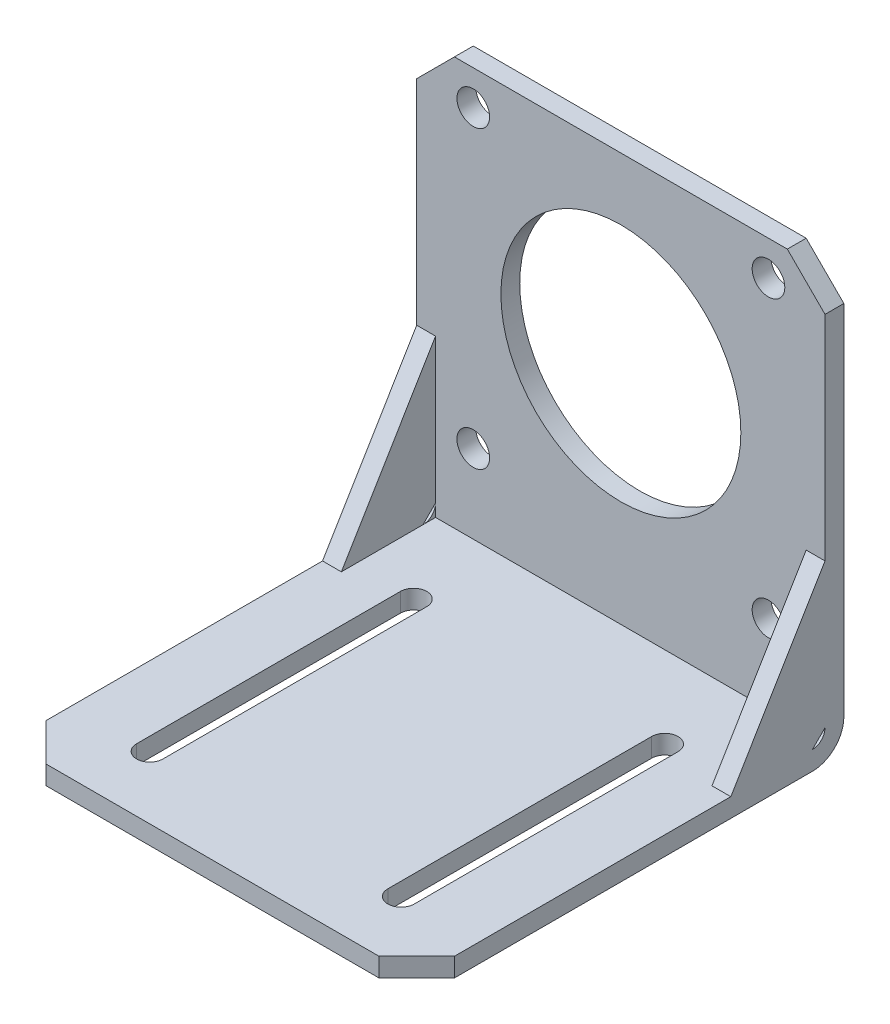
ISO-10303-21;
HEADER;
FILE_DESCRIPTION(('STEP AP214'),'2;1');
FILE_NAME('part.step','',(''),(''),'','','');
FILE_SCHEMA(('AUTOMOTIVE_DESIGN { 1 0 10303 214 1 1 1 1 }'));
ENDSEC;
DATA;
#1=APPLICATION_CONTEXT('core data for automotive mechanical design processes');
#2=APPLICATION_PROTOCOL_DEFINITION('international standard','automotive_design',2000,#1);
#3=PRODUCT_CONTEXT('',#1,'mechanical');
#4=PRODUCT('Part','Part','',(#3));
#5=PRODUCT_RELATED_PRODUCT_CATEGORY('part','',(#4));
#6=PRODUCT_DEFINITION_FORMATION('','',#4);
#7=PRODUCT_DEFINITION_CONTEXT('part definition',#1,'design');
#8=PRODUCT_DEFINITION('design','',#6,#7);
#9=PRODUCT_DEFINITION_SHAPE('','',#8);
#10=(LENGTH_UNIT() NAMED_UNIT(*) SI_UNIT(.MILLI.,.METRE.));
#11=(NAMED_UNIT(*) PLANE_ANGLE_UNIT() SI_UNIT($,.RADIAN.));
#12=(NAMED_UNIT(*) SI_UNIT($,.STERADIAN.) SOLID_ANGLE_UNIT());
#13=UNCERTAINTY_MEASURE_WITH_UNIT(LENGTH_MEASURE(1.E-05),#10,'distance_accuracy_value','');
#14=(GEOMETRIC_REPRESENTATION_CONTEXT(3) GLOBAL_UNCERTAINTY_ASSIGNED_CONTEXT((#13)) GLOBAL_UNIT_ASSIGNED_CONTEXT((#10,
#11,#12)) REPRESENTATION_CONTEXT('',''));
#15=CARTESIAN_POINT('',(0.,0.,0.));
#16=DIRECTION('',(0.,0.,1.));
#17=DIRECTION('',(1.,0.,0.));
#18=AXIS2_PLACEMENT_3D('',#15,#16,#17);
#19=CARTESIAN_POINT('',(0.,0.,0.));
#20=DIRECTION('',(0.,0.,1.));
#21=DIRECTION('',(1.,0.,0.));
#22=AXIS2_PLACEMENT_3D('',#19,#20,#21);
#23=PLANE('',#22);
#24=CARTESIAN_POINT('',(-23.5,12.5,0.));
#25=DIRECTION('',(0.,0.,1.));
#26=DIRECTION('',(1.,0.,0.));
#27=AXIS2_PLACEMENT_3D('',#24,#25,#26);
#28=CIRCLE('',#27,2.6);
#29=CARTESIAN_POINT('',(-20.9,12.5,0.));
#30=VERTEX_POINT('',#29);
#31=EDGE_CURVE('E468',#30,#30,#28,.T.);
#32=ORIENTED_EDGE('',*,*,#31,.T.);
#33=EDGE_LOOP('',(#32));
#34=FACE_BOUND('',#33,.T.);
#35=CARTESIAN_POINT('',(23.5,59.5,0.));
#36=DIRECTION('',(0.,0.,1.));
#37=DIRECTION('',(1.,0.,0.));
#38=AXIS2_PLACEMENT_3D('',#35,#36,#37);
#39=CIRCLE('',#38,2.6);
#40=CARTESIAN_POINT('',(26.1,59.5,0.));
#41=VERTEX_POINT('',#40);
#42=EDGE_CURVE('E456',#41,#41,#39,.T.);
#43=ORIENTED_EDGE('',*,*,#42,.T.);
#44=EDGE_LOOP('',(#43));
#45=FACE_BOUND('',#44,.T.);
#46=CARTESIAN_POINT('',(0.,36.,0.));
#47=DIRECTION('',(0.,0.,1.));
#48=DIRECTION('',(1.,0.,0.));
#49=AXIS2_PLACEMENT_3D('',#46,#47,#48);
#50=CIRCLE('',#49,19.1);
#51=CARTESIAN_POINT('',(19.1,36.,0.));
#52=VERTEX_POINT('',#51);
#53=EDGE_CURVE('E444',#52,#52,#50,.T.);
#54=ORIENTED_EDGE('',*,*,#53,.T.);
#55=EDGE_LOOP('',(#54));
#56=FACE_BOUND('',#55,.T.);
#57=CARTESIAN_POINT('',(-23.5,59.5,0.));
#58=DIRECTION('',(0.,0.,1.));
#59=DIRECTION('',(1.,0.,0.));
#60=AXIS2_PLACEMENT_3D('',#57,#58,#59);
#61=CIRCLE('',#60,2.6);
#62=CARTESIAN_POINT('',(-20.9,59.5,0.));
#63=VERTEX_POINT('',#62);
#64=EDGE_CURVE('E450',#63,#63,#61,.T.);
#65=ORIENTED_EDGE('',*,*,#64,.T.);
#66=EDGE_LOOP('',(#65));
#67=FACE_BOUND('',#66,.T.);
#68=CARTESIAN_POINT('',(23.5,12.5,0.));
#69=DIRECTION('',(0.,0.,1.));
#70=DIRECTION('',(1.,0.,0.));
#71=AXIS2_PLACEMENT_3D('',#68,#69,#70);
#72=CIRCLE('',#71,2.6);
#73=CARTESIAN_POINT('',(26.1,12.5,0.));
#74=VERTEX_POINT('',#73);
#75=EDGE_CURVE('E462',#74,#74,#72,.T.);
#76=ORIENTED_EDGE('',*,*,#75,.T.);
#77=EDGE_LOOP('',(#76));
#78=FACE_BOUND('',#77,.T.);
#79=DIRECTION('',(-1.,0.,0.));
#80=VECTOR('',#79,1.);
#81=CARTESIAN_POINT('',(32.5,1.99999999999998,0.));
#82=LINE('',#81,#80);
#83=CARTESIAN_POINT('',(32.5,1.99999999999998,0.));
#84=VERTEX_POINT('',#83);
#85=CARTESIAN_POINT('',(-32.5,1.99999999999998,0.));
#86=VERTEX_POINT('',#85);
#87=EDGE_CURVE('E246',#84,#86,#82,.T.);
#88=ORIENTED_EDGE('',*,*,#87,.T.);
#89=DIRECTION('',(0.,-1.,0.));
#90=VECTOR('',#89,1.);
#91=CARTESIAN_POINT('',(-32.5,59.,0.));
#92=LINE('',#91,#90);
#93=CARTESIAN_POINT('',(-32.5,59.,0.));
#94=VERTEX_POINT('',#93);
#95=EDGE_CURVE('E418',#94,#86,#92,.T.);
#96=ORIENTED_EDGE('',*,*,#95,.F.);
#97=DIRECTION('',(-0.707106781186548,-0.707106781186547,0.));
#98=VECTOR('',#97,1.);
#99=CARTESIAN_POINT('',(-32.5,59.,0.));
#100=LINE('',#99,#98);
#101=CARTESIAN_POINT('',(-26.5,65.,0.));
#102=VERTEX_POINT('',#101);
#103=EDGE_CURVE('E415',#102,#94,#100,.T.);
#104=ORIENTED_EDGE('',*,*,#103,.F.);
#105=DIRECTION('',(-1.,0.,0.));
#106=VECTOR('',#105,1.);
#107=CARTESIAN_POINT('',(-26.5,65.,0.));
#108=LINE('',#107,#106);
#109=CARTESIAN_POINT('',(26.5,65.,0.));
#110=VERTEX_POINT('',#109);
#111=EDGE_CURVE('E413',#110,#102,#108,.T.);
#112=ORIENTED_EDGE('',*,*,#111,.F.);
#113=DIRECTION('',(-0.707106781186547,0.707106781186548,0.));
#114=VECTOR('',#113,1.);
#115=CARTESIAN_POINT('',(32.5,59.,0.));
#116=LINE('',#115,#114);
#117=CARTESIAN_POINT('',(32.5,59.,0.));
#118=VERTEX_POINT('',#117);
#119=EDGE_CURVE('E423',#118,#110,#116,.T.);
#120=ORIENTED_EDGE('',*,*,#119,.F.);
#121=DIRECTION('',(0.,1.,0.));
#122=VECTOR('',#121,1.);
#123=CARTESIAN_POINT('',(32.5,0.,0.));
#124=LINE('',#123,#122);
#125=EDGE_CURVE('E421',#84,#118,#124,.T.);
#126=ORIENTED_EDGE('',*,*,#125,.F.);
#127=EDGE_LOOP('',(#88,#96,#104,#112,#120,#126));
#128=FACE_BOUND('',#127,.T.);
#129=ADVANCED_FACE('F32',(#34,#45,#56,#67,#78,#128),#23,.F.);
#130=CARTESIAN_POINT('',(32.5,-3.00000000000002,0.));
#131=DIRECTION('',(0.,-1.,0.));
#132=DIRECTION('',(0.,0.,-1.));
#133=AXIS2_PLACEMENT_3D('',#130,#131,#132);
#134=PLANE('',#133);
#135=CARTESIAN_POINT('',(20.,-2.99999999999998,58.));
#136=DIRECTION('',(0.,1.,0.));
#137=DIRECTION('',(0.,0.,1.));
#138=AXIS2_PLACEMENT_3D('',#135,#136,#137);
#139=CIRCLE('',#138,2.1);
#140=CARTESIAN_POINT('',(17.9,-2.99999999999998,58.));
#141=VERTEX_POINT('',#140);
#142=CARTESIAN_POINT('',(22.1,-2.99999999999998,58.));
#143=VERTEX_POINT('',#142);
#144=EDGE_CURVE('E283',#141,#143,#139,.T.);
#145=ORIENTED_EDGE('',*,*,#144,.T.);
#146=DIRECTION('',(0.,0.,-1.));
#147=VECTOR('',#146,1.);
#148=CARTESIAN_POINT('',(22.1,-2.99999999999998,58.));
#149=LINE('',#148,#147);
#150=CARTESIAN_POINT('',(22.1,-3.00000000000002,16.));
#151=VERTEX_POINT('',#150);
#152=EDGE_CURVE('E286',#143,#151,#149,.T.);
#153=ORIENTED_EDGE('',*,*,#152,.T.);
#154=CARTESIAN_POINT('',(20.,-3.,16.));
#155=DIRECTION('',(0.,1.,0.));
#156=DIRECTION('',(0.,0.,1.));
#157=AXIS2_PLACEMENT_3D('',#154,#155,#156);
#158=CIRCLE('',#157,2.1);
#159=CARTESIAN_POINT('',(17.9,-3.,16.));
#160=VERTEX_POINT('',#159);
#161=EDGE_CURVE('E290',#151,#160,#158,.T.);
#162=ORIENTED_EDGE('',*,*,#161,.T.);
#163=DIRECTION('',(0.,0.,1.));
#164=VECTOR('',#163,1.);
#165=CARTESIAN_POINT('',(17.9,-2.99999999999998,58.));
#166=LINE('',#165,#164);
#167=EDGE_CURVE('E293',#160,#141,#166,.T.);
#168=ORIENTED_EDGE('',*,*,#167,.T.);
#169=EDGE_LOOP('',(#145,#153,#162,#168));
#170=FACE_BOUND('',#169,.T.);
#171=CARTESIAN_POINT('',(-20.,-2.99999999999998,58.));
#172=DIRECTION('',(0.,1.,0.));
#173=DIRECTION('',(0.,0.,1.));
#174=AXIS2_PLACEMENT_3D('',#171,#172,#173);
#175=CIRCLE('',#174,2.1);
#176=CARTESIAN_POINT('',(-22.1,-2.99999999999998,58.));
#177=VERTEX_POINT('',#176);
#178=CARTESIAN_POINT('',(-17.9,-2.99999999999998,58.));
#179=VERTEX_POINT('',#178);
#180=EDGE_CURVE('E251',#177,#179,#175,.T.);
#181=ORIENTED_EDGE('',*,*,#180,.T.);
#182=DIRECTION('',(0.,0.,-1.));
#183=VECTOR('',#182,1.);
#184=CARTESIAN_POINT('',(-17.9,-2.99999999999998,58.));
#185=LINE('',#184,#183);
#186=CARTESIAN_POINT('',(-17.9,-3.00000000000002,16.));
#187=VERTEX_POINT('',#186);
#188=EDGE_CURVE('E254',#179,#187,#185,.T.);
#189=ORIENTED_EDGE('',*,*,#188,.T.);
#190=CARTESIAN_POINT('',(-20.,-3.,16.));
#191=DIRECTION('',(0.,1.,0.));
#192=DIRECTION('',(0.,0.,1.));
#193=AXIS2_PLACEMENT_3D('',#190,#191,#192);
#194=CIRCLE('',#193,2.1);
#195=CARTESIAN_POINT('',(-22.1,-3.,16.));
#196=VERTEX_POINT('',#195);
#197=EDGE_CURVE('E258',#187,#196,#194,.T.);
#198=ORIENTED_EDGE('',*,*,#197,.T.);
#199=DIRECTION('',(0.,0.,1.));
#200=VECTOR('',#199,1.);
#201=CARTESIAN_POINT('',(-22.1,-2.99999999999998,58.));
#202=LINE('',#201,#200);
#203=EDGE_CURVE('E261',#196,#177,#202,.T.);
#204=ORIENTED_EDGE('',*,*,#203,.T.);
#205=EDGE_LOOP('',(#181,#189,#198,#204));
#206=FACE_BOUND('',#205,.T.);
#207=DIRECTION('',(0.,0.,1.));
#208=VECTOR('',#207,1.);
#209=CARTESIAN_POINT('',(-32.5,-3.00000000000002,0.));
#210=LINE('',#209,#208);
#211=CARTESIAN_POINT('',(-32.5,-3.00000000000002,5.));
#212=VERTEX_POINT('',#211);
#213=CARTESIAN_POINT('',(-32.5,-3.00000000000002,62.));
#214=VERTEX_POINT('',#213);
#215=EDGE_CURVE('E378',#212,#214,#210,.T.);
#216=ORIENTED_EDGE('',*,*,#215,.F.);
#217=DIRECTION('',(-1.,0.,0.));
#218=VECTOR('',#217,1.);
#219=CARTESIAN_POINT('',(32.5,-3.00000000000002,5.));
#220=LINE('',#219,#218);
#221=CARTESIAN_POINT('',(32.5,-3.00000000000002,5.));
#222=VERTEX_POINT('',#221);
#223=EDGE_CURVE('E244',#222,#212,#220,.T.);
#224=ORIENTED_EDGE('',*,*,#223,.F.);
#225=DIRECTION('',(0.,0.,1.));
#226=VECTOR('',#225,1.);
#227=CARTESIAN_POINT('',(32.5,-3.00000000000002,0.));
#228=LINE('',#227,#226);
#229=CARTESIAN_POINT('',(32.5,-2.99999999999998,62.));
#230=VERTEX_POINT('',#229);
#231=EDGE_CURVE('E373',#222,#230,#228,.T.);
#232=ORIENTED_EDGE('',*,*,#231,.T.);
#233=DIRECTION('',(-0.707106781186542,0.,0.707106781186553));
#234=VECTOR('',#233,1.);
#235=CARTESIAN_POINT('',(32.5,-2.99999999999998,62.));
#236=LINE('',#235,#234);
#237=CARTESIAN_POINT('',(26.5000000000001,-3.00000000000002,68.));
#238=VERTEX_POINT('',#237);
#239=EDGE_CURVE('E315',#230,#238,#236,.T.);
#240=ORIENTED_EDGE('',*,*,#239,.T.);
#241=DIRECTION('',(-1.,0.,0.));
#242=VECTOR('',#241,1.);
#243=CARTESIAN_POINT('',(32.5,-3.00000000000002,68.));
#244=LINE('',#243,#242);
#245=CARTESIAN_POINT('',(-26.4999999999999,-2.99999999999998,68.));
#246=VERTEX_POINT('',#245);
#247=EDGE_CURVE('E474',#238,#246,#244,.T.);
#248=ORIENTED_EDGE('',*,*,#247,.T.);
#249=DIRECTION('',(-0.707106781186553,0.,-0.707106781186542));
#250=VECTOR('',#249,1.);
#251=CARTESIAN_POINT('',(-32.5,-2.99999999999998,62.));
#252=LINE('',#251,#250);
#253=EDGE_CURVE('E325',#246,#214,#252,.T.);
#254=ORIENTED_EDGE('',*,*,#253,.T.);
#255=EDGE_LOOP('',(#216,#224,#232,#240,#248,#254));
#256=FACE_BOUND('',#255,.T.);
#257=ADVANCED_FACE('F511',(#170,#206,#256),#134,.T.);
#258=CARTESIAN_POINT('',(0.,0.,3.));
#259=DIRECTION('',(0.,0.,1.));
#260=DIRECTION('',(1.,0.,0.));
#261=AXIS2_PLACEMENT_3D('',#258,#259,#260);
#262=PLANE('',#261);
#263=DIRECTION('',(1.,0.,0.));
#264=VECTOR('',#263,1.);
#265=CARTESIAN_POINT('',(29.5,25.,3.));
#266=LINE('',#265,#264);
#267=CARTESIAN_POINT('',(29.5,25.,3.));
#268=VERTEX_POINT('',#267);
#269=CARTESIAN_POINT('',(32.5,25.,3.));
#270=VERTEX_POINT('',#269);
#271=EDGE_CURVE('E345',#268,#270,#266,.T.);
#272=ORIENTED_EDGE('',*,*,#271,.T.);
#273=DIRECTION('',(0.,1.,0.));
#274=VECTOR('',#273,1.);
#275=CARTESIAN_POINT('',(32.5,0.,3.));
#276=LINE('',#275,#274);
#277=CARTESIAN_POINT('',(32.5,59.,3.));
#278=VERTEX_POINT('',#277);
#279=EDGE_CURVE('E399',#270,#278,#276,.T.);
#280=ORIENTED_EDGE('',*,*,#279,.T.);
#281=DIRECTION('',(-0.707106781186547,0.707106781186548,0.));
#282=VECTOR('',#281,1.);
#283=CARTESIAN_POINT('',(32.5,59.,3.));
#284=LINE('',#283,#282);
#285=CARTESIAN_POINT('',(26.5,65.,3.));
#286=VERTEX_POINT('',#285);
#287=EDGE_CURVE('E401',#278,#286,#284,.T.);
#288=ORIENTED_EDGE('',*,*,#287,.T.);
#289=DIRECTION('',(-1.,0.,0.));
#290=VECTOR('',#289,1.);
#291=CARTESIAN_POINT('',(-26.5,65.,3.));
#292=LINE('',#291,#290);
#293=CARTESIAN_POINT('',(-26.5,65.,3.));
#294=VERTEX_POINT('',#293);
#295=EDGE_CURVE('E425',#286,#294,#292,.T.);
#296=ORIENTED_EDGE('',*,*,#295,.T.);
#297=DIRECTION('',(-0.707106781186548,-0.707106781186547,0.));
#298=VECTOR('',#297,1.);
#299=CARTESIAN_POINT('',(-32.5,59.,3.));
#300=LINE('',#299,#298);
#301=CARTESIAN_POINT('',(-32.5,59.,3.));
#302=VERTEX_POINT('',#301);
#303=EDGE_CURVE('E409',#294,#302,#300,.T.);
#304=ORIENTED_EDGE('',*,*,#303,.T.);
#305=DIRECTION('',(0.,-1.,0.));
#306=VECTOR('',#305,1.);
#307=CARTESIAN_POINT('',(-32.5,59.,3.));
#308=LINE('',#307,#306);
#309=CARTESIAN_POINT('',(-32.5,25.,3.));
#310=VERTEX_POINT('',#309);
#311=EDGE_CURVE('E397',#302,#310,#308,.T.);
#312=ORIENTED_EDGE('',*,*,#311,.T.);
#313=DIRECTION('',(-1.,0.,0.));
#314=VECTOR('',#313,1.);
#315=CARTESIAN_POINT('',(-29.5,25.,3.));
#316=LINE('',#315,#314);
#317=CARTESIAN_POINT('',(-29.5,25.,3.));
#318=VERTEX_POINT('',#317);
#319=EDGE_CURVE('E366',#318,#310,#316,.T.);
#320=ORIENTED_EDGE('',*,*,#319,.F.);
#321=DIRECTION('',(0.,-1.,0.));
#322=VECTOR('',#321,1.);
#323=CARTESIAN_POINT('',(-29.5,0.,3.));
#324=LINE('',#323,#322);
#325=CARTESIAN_POINT('',(-29.5,0.,3.));
#326=VERTEX_POINT('',#325);
#327=EDGE_CURVE('E353',#318,#326,#324,.T.);
#328=ORIENTED_EDGE('',*,*,#327,.T.);
#329=DIRECTION('',(1.,0.,0.));
#330=VECTOR('',#329,1.);
#331=CARTESIAN_POINT('',(-32.5,0.,3.));
#332=LINE('',#331,#330);
#333=CARTESIAN_POINT('',(29.5,0.,3.));
#334=VERTEX_POINT('',#333);
#335=EDGE_CURVE('E402',#326,#334,#332,.T.);
#336=ORIENTED_EDGE('',*,*,#335,.T.);
#337=DIRECTION('',(0.,1.,0.));
#338=VECTOR('',#337,1.);
#339=CARTESIAN_POINT('',(29.5,0.,3.));
#340=LINE('',#339,#338);
#341=EDGE_CURVE('E336',#334,#268,#340,.T.);
#342=ORIENTED_EDGE('',*,*,#341,.T.);
#343=EDGE_LOOP('',(#272,#280,#288,#296,#304,#312,#320,#328,#336,#342));
#344=FACE_BOUND('',#343,.T.);
#345=CARTESIAN_POINT('',(23.5,12.5,3.));
#346=DIRECTION('',(0.,0.,1.));
#347=DIRECTION('',(1.,0.,0.));
#348=AXIS2_PLACEMENT_3D('',#345,#346,#347);
#349=CIRCLE('',#348,2.6);
#350=CARTESIAN_POINT('',(26.1,12.5,3.));
#351=VERTEX_POINT('',#350);
#352=EDGE_CURVE('E459',#351,#351,#349,.T.);
#353=ORIENTED_EDGE('',*,*,#352,.F.);
#354=EDGE_LOOP('',(#353));
#355=FACE_BOUND('',#354,.T.);
#356=CARTESIAN_POINT('',(-23.5,59.5,3.));
#357=DIRECTION('',(0.,0.,1.));
#358=DIRECTION('',(1.,0.,0.));
#359=AXIS2_PLACEMENT_3D('',#356,#357,#358);
#360=CIRCLE('',#359,2.6);
#361=CARTESIAN_POINT('',(-20.9,59.5,3.));
#362=VERTEX_POINT('',#361);
#363=EDGE_CURVE('E447',#362,#362,#360,.T.);
#364=ORIENTED_EDGE('',*,*,#363,.F.);
#365=EDGE_LOOP('',(#364));
#366=FACE_BOUND('',#365,.T.);
#367=CARTESIAN_POINT('',(0.,36.,3.));
#368=DIRECTION('',(0.,0.,1.));
#369=DIRECTION('',(1.,0.,0.));
#370=AXIS2_PLACEMENT_3D('',#367,#368,#369);
#371=CIRCLE('',#370,19.1);
#372=CARTESIAN_POINT('',(19.1,36.,3.));
#373=VERTEX_POINT('',#372);
#374=EDGE_CURVE('E416',#373,#373,#371,.T.);
#375=ORIENTED_EDGE('',*,*,#374,.F.);
#376=EDGE_LOOP('',(#375));
#377=FACE_BOUND('',#376,.T.);
#378=CARTESIAN_POINT('',(23.5,59.5,3.));
#379=DIRECTION('',(0.,0.,1.));
#380=DIRECTION('',(1.,0.,0.));
#381=AXIS2_PLACEMENT_3D('',#378,#379,#380);
#382=CIRCLE('',#381,2.6);
#383=CARTESIAN_POINT('',(26.1,59.5,3.));
#384=VERTEX_POINT('',#383);
#385=EDGE_CURVE('E453',#384,#384,#382,.T.);
#386=ORIENTED_EDGE('',*,*,#385,.F.);
#387=EDGE_LOOP('',(#386));
#388=FACE_BOUND('',#387,.T.);
#389=CARTESIAN_POINT('',(-23.5,12.5,3.));
#390=DIRECTION('',(0.,0.,1.));
#391=DIRECTION('',(1.,0.,0.));
#392=AXIS2_PLACEMENT_3D('',#389,#390,#391);
#393=CIRCLE('',#392,2.6);
#394=CARTESIAN_POINT('',(-20.9,12.5,3.));
#395=VERTEX_POINT('',#394);
#396=EDGE_CURVE('E465',#395,#395,#393,.T.);
#397=ORIENTED_EDGE('',*,*,#396,.F.);
#398=EDGE_LOOP('',(#397));
#399=FACE_BOUND('',#398,.T.);
#400=ADVANCED_FACE('F500',(#344,#355,#366,#377,#388,#399),#262,.T.);
#401=CARTESIAN_POINT('',(-26.5,65.,3.));
#402=DIRECTION('',(0.,-1.,0.));
#403=DIRECTION('',(1.,0.,0.));
#404=AXIS2_PLACEMENT_3D('',#401,#402,#403);
#405=PLANE('',#404);
#406=ORIENTED_EDGE('',*,*,#111,.T.);
#407=DIRECTION('',(0.,0.,-1.));
#408=VECTOR('',#407,1.);
#409=CARTESIAN_POINT('',(-26.5,65.,3.));
#410=LINE('',#409,#408);
#411=EDGE_CURVE('E380',#294,#102,#410,.T.);
#412=ORIENTED_EDGE('',*,*,#411,.F.);
#413=ORIENTED_EDGE('',*,*,#295,.F.);
#414=DIRECTION('',(0.,0.,-1.));
#415=VECTOR('',#414,1.);
#416=CARTESIAN_POINT('',(26.5,65.,3.));
#417=LINE('',#416,#415);
#418=EDGE_CURVE('E412',#286,#110,#417,.T.);
#419=ORIENTED_EDGE('',*,*,#418,.T.);
#420=EDGE_LOOP('',(#406,#412,#413,#419));
#421=FACE_BOUND('',#420,.T.);
#422=ADVANCED_FACE('F34',(#421),#405,.F.);
#423=CARTESIAN_POINT('',(-32.5,59.,3.));
#424=DIRECTION('',(0.707106781186547,-0.707106781186548,0.));
#425=DIRECTION('',(0.707106781186548,0.707106781186547,0.));
#426=AXIS2_PLACEMENT_3D('',#423,#424,#425);
#427=PLANE('',#426);
#428=ORIENTED_EDGE('',*,*,#103,.T.);
#429=DIRECTION('',(0.,0.,-1.));
#430=VECTOR('',#429,1.);
#431=CARTESIAN_POINT('',(-32.5,59.,3.));
#432=LINE('',#431,#430);
#433=EDGE_CURVE('E385',#302,#94,#432,.T.);
#434=ORIENTED_EDGE('',*,*,#433,.F.);
#435=ORIENTED_EDGE('',*,*,#303,.F.);
#436=ORIENTED_EDGE('',*,*,#411,.T.);
#437=EDGE_LOOP('',(#428,#434,#435,#436));
#438=FACE_BOUND('',#437,.T.);
#439=ADVANCED_FACE('F552',(#438),#427,.F.);
#440=CARTESIAN_POINT('',(-32.5,59.,3.));
#441=DIRECTION('',(1.,0.,0.));
#442=DIRECTION('',(0.,0.,-1.));
#443=AXIS2_PLACEMENT_3D('',#440,#441,#442);
#444=PLANE('',#443);
#445=DIRECTION('',(0.,0.707106781186548,-0.707106781186547));
#446=VECTOR('',#445,1.);
#447=CARTESIAN_POINT('',(-32.5,2.,3.00255068199679));
#448=LINE('',#447,#446);
#449=CARTESIAN_POINT('',(-32.5,0.,5.00255068199679));
#450=VERTEX_POINT('',#449);
#451=CARTESIAN_POINT('',(-32.5,2.,3.00255068199679));
#452=VERTEX_POINT('',#451);
#453=EDGE_CURVE('E227',#450,#452,#448,.T.);
#454=ORIENTED_EDGE('',*,*,#453,.F.);
#455=CARTESIAN_POINT('',(-32.5,2.,5.00255068199679));
#456=DIRECTION('',(-1.,0.,0.));
#457=DIRECTION('',(0.,0.,-1.));
#458=AXIS2_PLACEMENT_3D('',#455,#456,#457);
#459=CIRCLE('',#458,2.);
#460=EDGE_CURVE('E47',#452,#450,#459,.T.);
#461=ORIENTED_EDGE('',*,*,#460,.F.);
#462=EDGE_LOOP('',(#454,#461));
#463=FACE_BOUND('',#462,.T.);
#464=ORIENTED_EDGE('',*,*,#95,.T.);
#465=CARTESIAN_POINT('',(-32.5,1.99999999999998,5.));
#466=DIRECTION('',(1.,0.,0.));
#467=DIRECTION('',(0.,0.,-1.));
#468=AXIS2_PLACEMENT_3D('',#465,#466,#467);
#469=CIRCLE('',#468,5.);
#470=EDGE_CURVE('E240',#212,#86,#469,.T.);
#471=ORIENTED_EDGE('',*,*,#470,.F.);
#472=ORIENTED_EDGE('',*,*,#215,.T.);
#473=DIRECTION('',(0.,1.,0.));
#474=VECTOR('',#473,1.);
#475=CARTESIAN_POINT('',(-32.5,-2.99999999999998,62.));
#476=LINE('',#475,#474);
#477=CARTESIAN_POINT('',(-32.5,0.,62.));
#478=VERTEX_POINT('',#477);
#479=EDGE_CURVE('E330',#214,#478,#476,.T.);
#480=ORIENTED_EDGE('',*,*,#479,.T.);
#481=DIRECTION('',(0.,0.,-1.));
#482=VECTOR('',#481,1.);
#483=CARTESIAN_POINT('',(-32.5,0.,68.));
#484=LINE('',#483,#482);
#485=CARTESIAN_POINT('',(-32.5,0.,18.));
#486=VERTEX_POINT('',#485);
#487=EDGE_CURVE('E368',#478,#486,#484,.T.);
#488=ORIENTED_EDGE('',*,*,#487,.T.);
#489=DIRECTION('',(0.,0.857492925712544,-0.514495755427526));
#490=VECTOR('',#489,1.);
#491=CARTESIAN_POINT('',(-32.5,25.,3.));
#492=LINE('',#491,#490);
#493=EDGE_CURVE('E351',#486,#310,#492,.T.);
#494=ORIENTED_EDGE('',*,*,#493,.T.);
#495=ORIENTED_EDGE('',*,*,#311,.F.);
#496=ORIENTED_EDGE('',*,*,#433,.T.);
#497=EDGE_LOOP('',(#464,#471,#472,#480,#488,#494,#495,#496));
#498=FACE_BOUND('',#497,.T.);
#499=ADVANCED_FACE('F484',(#463,#498),#444,.F.);
#500=CARTESIAN_POINT('',(32.5,0.,3.));
#501=DIRECTION('',(-1.,0.,0.));
#502=DIRECTION('',(0.,0.,1.));
#503=AXIS2_PLACEMENT_3D('',#500,#501,#502);
#504=PLANE('',#503);
#505=DIRECTION('',(0.,0.707106781186548,-0.707106781186547));
#506=VECTOR('',#505,1.);
#507=CARTESIAN_POINT('',(32.5,2.,3.00255068199679));
#508=LINE('',#507,#506);
#509=CARTESIAN_POINT('',(32.5,0.,5.00255068199679));
#510=VERTEX_POINT('',#509);
#511=CARTESIAN_POINT('',(32.5,2.,3.00255068199679));
#512=VERTEX_POINT('',#511);
#513=EDGE_CURVE('E220',#510,#512,#508,.T.);
#514=ORIENTED_EDGE('',*,*,#513,.T.);
#515=CARTESIAN_POINT('',(32.5,2.,5.00255068199679));
#516=DIRECTION('',(-1.,0.,0.));
#517=DIRECTION('',(0.,0.,-1.));
#518=AXIS2_PLACEMENT_3D('',#515,#516,#517);
#519=CIRCLE('',#518,2.);
#520=EDGE_CURVE('E55',#512,#510,#519,.T.);
#521=ORIENTED_EDGE('',*,*,#520,.T.);
#522=EDGE_LOOP('',(#514,#521));
#523=FACE_BOUND('',#522,.T.);
#524=ORIENTED_EDGE('',*,*,#231,.F.);
#525=CARTESIAN_POINT('',(32.5,1.99999999999998,5.));
#526=DIRECTION('',(1.,0.,0.));
#527=DIRECTION('',(0.,0.,-1.));
#528=AXIS2_PLACEMENT_3D('',#525,#526,#527);
#529=CIRCLE('',#528,5.);
#530=EDGE_CURVE('E241',#222,#84,#529,.T.);
#531=ORIENTED_EDGE('',*,*,#530,.T.);
#532=ORIENTED_EDGE('',*,*,#125,.T.);
#533=DIRECTION('',(0.,0.,-1.));
#534=VECTOR('',#533,1.);
#535=CARTESIAN_POINT('',(32.5,59.,3.));
#536=LINE('',#535,#534);
#537=EDGE_CURVE('E391',#278,#118,#536,.T.);
#538=ORIENTED_EDGE('',*,*,#537,.F.);
#539=ORIENTED_EDGE('',*,*,#279,.F.);
#540=DIRECTION('',(0.,-0.857492925712544,0.514495755427527));
#541=VECTOR('',#540,1.);
#542=CARTESIAN_POINT('',(32.5,25.,3.));
#543=LINE('',#542,#541);
#544=CARTESIAN_POINT('',(32.5,0.,18.));
#545=VERTEX_POINT('',#544);
#546=EDGE_CURVE('E333',#270,#545,#543,.T.);
#547=ORIENTED_EDGE('',*,*,#546,.T.);
#548=DIRECTION('',(0.,0.,-1.));
#549=VECTOR('',#548,1.);
#550=CARTESIAN_POINT('',(32.5,0.,68.));
#551=LINE('',#550,#549);
#552=CARTESIAN_POINT('',(32.5,0.,62.));
#553=VERTEX_POINT('',#552);
#554=EDGE_CURVE('E376',#553,#545,#551,.T.);
#555=ORIENTED_EDGE('',*,*,#554,.F.);
#556=DIRECTION('',(0.,1.,0.));
#557=VECTOR('',#556,1.);
#558=CARTESIAN_POINT('',(32.5,-2.99999999999998,62.));
#559=LINE('',#558,#557);
#560=EDGE_CURVE('E318',#230,#553,#559,.T.);
#561=ORIENTED_EDGE('',*,*,#560,.F.);
#562=EDGE_LOOP('',(#524,#531,#532,#538,#539,#547,#555,#561));
#563=FACE_BOUND('',#562,.T.);
#564=ADVANCED_FACE('F225',(#523,#563),#504,.F.);
#565=CARTESIAN_POINT('',(32.5,59.,3.));
#566=DIRECTION('',(-0.707106781186548,-0.707106781186547,0.));
#567=DIRECTION('',(0.707106781186547,-0.707106781186548,0.));
#568=AXIS2_PLACEMENT_3D('',#565,#566,#567);
#569=PLANE('',#568);
#570=ORIENTED_EDGE('',*,*,#119,.T.);
#571=ORIENTED_EDGE('',*,*,#418,.F.);
#572=ORIENTED_EDGE('',*,*,#287,.F.);
#573=ORIENTED_EDGE('',*,*,#537,.T.);
#574=EDGE_LOOP('',(#570,#571,#572,#573));
#575=FACE_BOUND('',#574,.T.);
#576=ADVANCED_FACE('F432',(#575),#569,.F.);
#577=CARTESIAN_POINT('',(0.,36.,3.));
#578=DIRECTION('',(0.,0.,-1.));
#579=DIRECTION('',(-1.,0.,0.));
#580=AXIS2_PLACEMENT_3D('',#577,#578,#579);
#581=CYLINDRICAL_SURFACE('',#580,19.1);
#582=ORIENTED_EDGE('',*,*,#374,.T.);
#583=EDGE_LOOP('',(#582));
#584=FACE_BOUND('',#583,.T.);
#585=ORIENTED_EDGE('',*,*,#53,.F.);
#586=EDGE_LOOP('',(#585));
#587=FACE_BOUND('',#586,.T.);
#588=ADVANCED_FACE('F548',(#584,#587),#581,.F.);
#589=CARTESIAN_POINT('',(-23.5,59.5,3.));
#590=DIRECTION('',(0.,0.,-1.));
#591=DIRECTION('',(-1.,0.,0.));
#592=AXIS2_PLACEMENT_3D('',#589,#590,#591);
#593=CYLINDRICAL_SURFACE('',#592,2.6);
#594=ORIENTED_EDGE('',*,*,#363,.T.);
#595=EDGE_LOOP('',(#594));
#596=FACE_BOUND('',#595,.T.);
#597=ORIENTED_EDGE('',*,*,#64,.F.);
#598=EDGE_LOOP('',(#597));
#599=FACE_BOUND('',#598,.T.);
#600=ADVANCED_FACE('F792',(#596,#599),#593,.F.);
#601=CARTESIAN_POINT('',(23.5,59.5,3.));
#602=DIRECTION('',(0.,0.,-1.));
#603=DIRECTION('',(-1.,0.,0.));
#604=AXIS2_PLACEMENT_3D('',#601,#602,#603);
#605=CYLINDRICAL_SURFACE('',#604,2.6);
#606=ORIENTED_EDGE('',*,*,#385,.T.);
#607=EDGE_LOOP('',(#606));
#608=FACE_BOUND('',#607,.T.);
#609=ORIENTED_EDGE('',*,*,#42,.F.);
#610=EDGE_LOOP('',(#609));
#611=FACE_BOUND('',#610,.T.);
#612=ADVANCED_FACE('F788',(#608,#611),#605,.F.);
#613=CARTESIAN_POINT('',(23.5,12.5,3.));
#614=DIRECTION('',(0.,0.,-1.));
#615=DIRECTION('',(-1.,0.,0.));
#616=AXIS2_PLACEMENT_3D('',#613,#614,#615);
#617=CYLINDRICAL_SURFACE('',#616,2.6);
#618=ORIENTED_EDGE('',*,*,#352,.T.);
#619=EDGE_LOOP('',(#618));
#620=FACE_BOUND('',#619,.T.);
#621=ORIENTED_EDGE('',*,*,#75,.F.);
#622=EDGE_LOOP('',(#621));
#623=FACE_BOUND('',#622,.T.);
#624=ADVANCED_FACE('F784',(#620,#623),#617,.F.);
#625=CARTESIAN_POINT('',(-23.5,12.5,3.));
#626=DIRECTION('',(0.,0.,-1.));
#627=DIRECTION('',(-1.,0.,0.));
#628=AXIS2_PLACEMENT_3D('',#625,#626,#627);
#629=CYLINDRICAL_SURFACE('',#628,2.6);
#630=ORIENTED_EDGE('',*,*,#396,.T.);
#631=EDGE_LOOP('',(#630));
#632=FACE_BOUND('',#631,.T.);
#633=ORIENTED_EDGE('',*,*,#31,.F.);
#634=EDGE_LOOP('',(#633));
#635=FACE_BOUND('',#634,.T.);
#636=ADVANCED_FACE('F601',(#632,#635),#629,.F.);
#637=CARTESIAN_POINT('',(32.5,0.,68.));
#638=DIRECTION('',(0.,1.,0.));
#639=DIRECTION('',(0.,0.,1.));
#640=AXIS2_PLACEMENT_3D('',#637,#638,#639);
#641=PLANE('',#640);
#642=DIRECTION('',(0.,0.,-1.));
#643=VECTOR('',#642,1.);
#644=CARTESIAN_POINT('',(29.5,0.,3.));
#645=LINE('',#644,#643);
#646=CARTESIAN_POINT('',(29.5,0.,18.));
#647=VERTEX_POINT('',#646);
#648=CARTESIAN_POINT('',(29.5,0.,5.0025506819968));
#649=VERTEX_POINT('',#648);
#650=EDGE_CURVE('E342',#647,#649,#645,.T.);
#651=ORIENTED_EDGE('',*,*,#650,.T.);
#652=EDGE_CURVE('E341',#649,#334,#645,.T.);
#653=ORIENTED_EDGE('',*,*,#652,.T.);
#654=ORIENTED_EDGE('',*,*,#335,.F.);
#655=DIRECTION('',(0.,0.,1.));
#656=VECTOR('',#655,1.);
#657=CARTESIAN_POINT('',(-29.5,0.,18.));
#658=LINE('',#657,#656);
#659=CARTESIAN_POINT('',(-29.5,0.,5.00255068199679));
#660=VERTEX_POINT('',#659);
#661=EDGE_CURVE('E357',#326,#660,#658,.T.);
#662=ORIENTED_EDGE('',*,*,#661,.T.);
#663=CARTESIAN_POINT('',(-29.5,0.,18.));
#664=VERTEX_POINT('',#663);
#665=EDGE_CURVE('E356',#660,#664,#658,.T.);
#666=ORIENTED_EDGE('',*,*,#665,.T.);
#667=DIRECTION('',(-1.,0.,0.));
#668=VECTOR('',#667,1.);
#669=CARTESIAN_POINT('',(-29.5,0.,18.));
#670=LINE('',#669,#668);
#671=EDGE_CURVE('E363',#664,#486,#670,.T.);
#672=ORIENTED_EDGE('',*,*,#671,.T.);
#673=ORIENTED_EDGE('',*,*,#487,.F.);
#674=DIRECTION('',(-0.707106781186553,0.,-0.707106781186542));
#675=VECTOR('',#674,1.);
#676=CARTESIAN_POINT('',(-32.5,0.,62.));
#677=LINE('',#676,#675);
#678=CARTESIAN_POINT('',(-26.4999999999999,0.,68.));
#679=VERTEX_POINT('',#678);
#680=EDGE_CURVE('E323',#679,#478,#677,.T.);
#681=ORIENTED_EDGE('',*,*,#680,.F.);
#682=DIRECTION('',(-1.,0.,0.));
#683=VECTOR('',#682,1.);
#684=CARTESIAN_POINT('',(32.5,0.,68.));
#685=LINE('',#684,#683);
#686=CARTESIAN_POINT('',(26.5000000000001,0.,68.));
#687=VERTEX_POINT('',#686);
#688=EDGE_CURVE('E471',#687,#679,#685,.T.);
#689=ORIENTED_EDGE('',*,*,#688,.F.);
#690=DIRECTION('',(-0.707106781186542,0.,0.707106781186553));
#691=VECTOR('',#690,1.);
#692=CARTESIAN_POINT('',(32.5,0.,62.));
#693=LINE('',#692,#691);
#694=EDGE_CURVE('E308',#553,#687,#693,.T.);
#695=ORIENTED_EDGE('',*,*,#694,.F.);
#696=ORIENTED_EDGE('',*,*,#554,.T.);
#697=DIRECTION('',(1.,0.,0.));
#698=VECTOR('',#697,1.);
#699=CARTESIAN_POINT('',(29.5,0.,18.));
#700=LINE('',#699,#698);
#701=EDGE_CURVE('E348',#647,#545,#700,.T.);
#702=ORIENTED_EDGE('',*,*,#701,.F.);
#703=EDGE_LOOP('',(#651,#653,#654,#662,#666,#672,#673,#681,#689,#695,#696,#702));
#704=FACE_BOUND('',#703,.T.);
#705=CARTESIAN_POINT('',(-20.,0.,58.));
#706=DIRECTION('',(0.,1.,0.));
#707=DIRECTION('',(0.,0.,1.));
#708=AXIS2_PLACEMENT_3D('',#705,#706,#707);
#709=CIRCLE('',#708,2.1);
#710=CARTESIAN_POINT('',(-22.1,0.,58.));
#711=VERTEX_POINT('',#710);
#712=CARTESIAN_POINT('',(-17.9,0.,58.));
#713=VERTEX_POINT('',#712);
#714=EDGE_CURVE('E249',#711,#713,#709,.T.);
#715=ORIENTED_EDGE('',*,*,#714,.F.);
#716=DIRECTION('',(0.,0.,1.));
#717=VECTOR('',#716,1.);
#718=CARTESIAN_POINT('',(-22.1,0.,58.));
#719=LINE('',#718,#717);
#720=CARTESIAN_POINT('',(-22.1,0.,16.));
#721=VERTEX_POINT('',#720);
#722=EDGE_CURVE('E255',#721,#711,#719,.T.);
#723=ORIENTED_EDGE('',*,*,#722,.F.);
#724=CARTESIAN_POINT('',(-20.,0.,16.));
#725=DIRECTION('',(0.,1.,0.));
#726=DIRECTION('',(0.,0.,1.));
#727=AXIS2_PLACEMENT_3D('',#724,#725,#726);
#728=CIRCLE('',#727,2.1);
#729=CARTESIAN_POINT('',(-17.9,0.,16.));
#730=VERTEX_POINT('',#729);
#731=EDGE_CURVE('E269',#730,#721,#728,.T.);
#732=ORIENTED_EDGE('',*,*,#731,.F.);
#733=DIRECTION('',(0.,0.,-1.));
#734=VECTOR('',#733,1.);
#735=CARTESIAN_POINT('',(-17.9,0.,58.));
#736=LINE('',#735,#734);
#737=EDGE_CURVE('E266',#713,#730,#736,.T.);
#738=ORIENTED_EDGE('',*,*,#737,.F.);
#739=EDGE_LOOP('',(#715,#723,#732,#738));
#740=FACE_BOUND('',#739,.T.);
#741=CARTESIAN_POINT('',(20.,0.,58.));
#742=DIRECTION('',(0.,1.,0.));
#743=DIRECTION('',(0.,0.,1.));
#744=AXIS2_PLACEMENT_3D('',#741,#742,#743);
#745=CIRCLE('',#744,2.1);
#746=CARTESIAN_POINT('',(17.9,0.,58.));
#747=VERTEX_POINT('',#746);
#748=CARTESIAN_POINT('',(22.1,0.,58.));
#749=VERTEX_POINT('',#748);
#750=EDGE_CURVE('E276',#747,#749,#745,.T.);
#751=ORIENTED_EDGE('',*,*,#750,.F.);
#752=DIRECTION('',(0.,0.,1.));
#753=VECTOR('',#752,1.);
#754=CARTESIAN_POINT('',(17.9,0.,58.));
#755=LINE('',#754,#753);
#756=CARTESIAN_POINT('',(17.9,0.,16.));
#757=VERTEX_POINT('',#756);
#758=EDGE_CURVE('E287',#757,#747,#755,.T.);
#759=ORIENTED_EDGE('',*,*,#758,.F.);
#760=CARTESIAN_POINT('',(20.,0.,16.));
#761=DIRECTION('',(0.,1.,0.));
#762=DIRECTION('',(0.,0.,1.));
#763=AXIS2_PLACEMENT_3D('',#760,#761,#762);
#764=CIRCLE('',#763,2.1);
#765=CARTESIAN_POINT('',(22.1,0.,16.));
#766=VERTEX_POINT('',#765);
#767=EDGE_CURVE('E301',#766,#757,#764,.T.);
#768=ORIENTED_EDGE('',*,*,#767,.F.);
#769=DIRECTION('',(0.,0.,-1.));
#770=VECTOR('',#769,1.);
#771=CARTESIAN_POINT('',(22.1,0.,58.));
#772=LINE('',#771,#770);
#773=EDGE_CURVE('E298',#749,#766,#772,.T.);
#774=ORIENTED_EDGE('',*,*,#773,.F.);
#775=EDGE_LOOP('',(#751,#759,#768,#774));
#776=FACE_BOUND('',#775,.T.);
#777=ADVANCED_FACE('F494',(#704,#740,#776),#641,.T.);
#778=CARTESIAN_POINT('',(32.5,-3.00000000000002,68.));
#779=DIRECTION('',(0.,0.,1.));
#780=DIRECTION('',(1.,0.,0.));
#781=AXIS2_PLACEMENT_3D('',#778,#779,#780);
#782=PLANE('',#781);
#783=DIRECTION('',(0.,1.,0.));
#784=VECTOR('',#783,1.);
#785=CARTESIAN_POINT('',(26.5000000000001,-2.99999999999998,68.));
#786=LINE('',#785,#784);
#787=EDGE_CURVE('E320',#238,#687,#786,.T.);
#788=ORIENTED_EDGE('',*,*,#787,.T.);
#789=ORIENTED_EDGE('',*,*,#688,.T.);
#790=DIRECTION('',(0.,1.,0.));
#791=VECTOR('',#790,1.);
#792=CARTESIAN_POINT('',(-26.4999999999999,-2.99999999999998,68.));
#793=LINE('',#792,#791);
#794=EDGE_CURVE('E328',#246,#679,#793,.T.);
#795=ORIENTED_EDGE('',*,*,#794,.F.);
#796=ORIENTED_EDGE('',*,*,#247,.F.);
#797=EDGE_LOOP('',(#788,#789,#795,#796));
#798=FACE_BOUND('',#797,.T.);
#799=ADVANCED_FACE('F518',(#798),#782,.T.);
#800=CARTESIAN_POINT('',(-29.5,25.,3.));
#801=DIRECTION('',(0.,0.514495755427526,0.857492925712544));
#802=DIRECTION('',(0.,-0.857492925712544,0.514495755427526));
#803=AXIS2_PLACEMENT_3D('',#800,#801,#802);
#804=PLANE('',#803);
#805=ORIENTED_EDGE('',*,*,#493,.F.);
#806=ORIENTED_EDGE('',*,*,#671,.F.);
#807=DIRECTION('',(0.,0.857492925712544,-0.514495755427526));
#808=VECTOR('',#807,1.);
#809=CARTESIAN_POINT('',(-29.5,25.,3.));
#810=LINE('',#809,#808);
#811=EDGE_CURVE('E360',#664,#318,#810,.T.);
#812=ORIENTED_EDGE('',*,*,#811,.T.);
#813=ORIENTED_EDGE('',*,*,#319,.T.);
#814=EDGE_LOOP('',(#805,#806,#812,#813));
#815=FACE_BOUND('',#814,.T.);
#816=ADVANCED_FACE('F491',(#815),#804,.T.);
#817=CARTESIAN_POINT('',(-29.5,0.,0.));
#818=DIRECTION('',(-1.,0.,0.));
#819=DIRECTION('',(0.,0.,1.));
#820=AXIS2_PLACEMENT_3D('',#817,#818,#819);
#821=PLANE('',#820);
#822=DIRECTION('',(0.,0.707106781186548,-0.707106781186547));
#823=VECTOR('',#822,1.);
#824=CARTESIAN_POINT('',(-29.5,2.50127534099839,2.50127534099839));
#825=LINE('',#824,#823);
#826=CARTESIAN_POINT('',(-29.5,2.,3.00255068199679));
#827=VERTEX_POINT('',#826);
#828=EDGE_CURVE('E233',#660,#827,#825,.T.);
#829=ORIENTED_EDGE('',*,*,#828,.T.);
#830=CARTESIAN_POINT('',(-29.5,2.,5.00255068199679));
#831=DIRECTION('',(-1.,0.,0.));
#832=DIRECTION('',(0.,0.,1.));
#833=AXIS2_PLACEMENT_3D('',#830,#831,#832);
#834=CIRCLE('',#833,2.);
#835=EDGE_CURVE('E237',#827,#660,#834,.T.);
#836=ORIENTED_EDGE('',*,*,#835,.T.);
#837=ORIENTED_EDGE('',*,*,#661,.F.);
#838=ORIENTED_EDGE('',*,*,#327,.F.);
#839=ORIENTED_EDGE('',*,*,#811,.F.);
#840=ORIENTED_EDGE('',*,*,#665,.F.);
#841=EDGE_LOOP('',(#829,#836,#837,#838,#839,#840));
#842=FACE_BOUND('',#841,.T.);
#843=ADVANCED_FACE('F499',(#842),#821,.F.);
#844=CARTESIAN_POINT('',(29.5,25.,3.));
#845=DIRECTION('',(0.,0.514495755427527,0.857492925712544));
#846=DIRECTION('',(0.,-0.857492925712544,0.514495755427527));
#847=AXIS2_PLACEMENT_3D('',#844,#845,#846);
#848=PLANE('',#847);
#849=ORIENTED_EDGE('',*,*,#546,.F.);
#850=ORIENTED_EDGE('',*,*,#271,.F.);
#851=DIRECTION('',(0.,-0.857492925712544,0.514495755427527));
#852=VECTOR('',#851,1.);
#853=CARTESIAN_POINT('',(29.5,25.,3.));
#854=LINE('',#853,#852);
#855=EDGE_CURVE('E338',#268,#647,#854,.T.);
#856=ORIENTED_EDGE('',*,*,#855,.T.);
#857=ORIENTED_EDGE('',*,*,#701,.T.);
#858=EDGE_LOOP('',(#849,#850,#856,#857));
#859=FACE_BOUND('',#858,.T.);
#860=ADVANCED_FACE('F532',(#859),#848,.T.);
#861=CARTESIAN_POINT('',(29.5,0.,0.));
#862=DIRECTION('',(1.,0.,0.));
#863=DIRECTION('',(0.,0.,-1.));
#864=AXIS2_PLACEMENT_3D('',#861,#862,#863);
#865=PLANE('',#864);
#866=ORIENTED_EDGE('',*,*,#652,.F.);
#867=CARTESIAN_POINT('',(29.5,2.,5.00255068199679));
#868=DIRECTION('',(1.,0.,0.));
#869=DIRECTION('',(0.,0.,-1.));
#870=AXIS2_PLACEMENT_3D('',#867,#868,#869);
#871=CIRCLE('',#870,2.);
#872=CARTESIAN_POINT('',(29.5,2.,3.00255068199679));
#873=VERTEX_POINT('',#872);
#874=EDGE_CURVE('E11',#649,#873,#871,.T.);
#875=ORIENTED_EDGE('',*,*,#874,.T.);
#876=DIRECTION('',(0.,-0.707106781186548,0.707106781186547));
#877=VECTOR('',#876,1.);
#878=CARTESIAN_POINT('',(29.5,2.50127534099839,2.50127534099839));
#879=LINE('',#878,#877);
#880=EDGE_CURVE('E40',#873,#649,#879,.T.);
#881=ORIENTED_EDGE('',*,*,#880,.T.);
#882=ORIENTED_EDGE('',*,*,#650,.F.);
#883=ORIENTED_EDGE('',*,*,#855,.F.);
#884=ORIENTED_EDGE('',*,*,#341,.F.);
#885=EDGE_LOOP('',(#866,#875,#881,#882,#883,#884));
#886=FACE_BOUND('',#885,.T.);
#887=ADVANCED_FACE('F524',(#886),#865,.F.);
#888=CARTESIAN_POINT('',(-32.5,-2.99999999999998,62.));
#889=DIRECTION('',(0.707106781186542,0.,-0.707106781186553));
#890=DIRECTION('',(-0.707106781186553,0.,-0.707106781186542));
#891=AXIS2_PLACEMENT_3D('',#888,#889,#890);
#892=PLANE('',#891);
#893=ORIENTED_EDGE('',*,*,#680,.T.);
#894=ORIENTED_EDGE('',*,*,#479,.F.);
#895=ORIENTED_EDGE('',*,*,#253,.F.);
#896=ORIENTED_EDGE('',*,*,#794,.T.);
#897=EDGE_LOOP('',(#893,#894,#895,#896));
#898=FACE_BOUND('',#897,.T.);
#899=ADVANCED_FACE('F521',(#898),#892,.F.);
#900=CARTESIAN_POINT('',(32.5,-2.99999999999998,62.));
#901=DIRECTION('',(-0.707106781186553,0.,-0.707106781186542));
#902=DIRECTION('',(-0.707106781186542,0.,0.707106781186553));
#903=AXIS2_PLACEMENT_3D('',#900,#901,#902);
#904=PLANE('',#903);
#905=ORIENTED_EDGE('',*,*,#694,.T.);
#906=ORIENTED_EDGE('',*,*,#787,.F.);
#907=ORIENTED_EDGE('',*,*,#239,.F.);
#908=ORIENTED_EDGE('',*,*,#560,.T.);
#909=EDGE_LOOP('',(#905,#906,#907,#908));
#910=FACE_BOUND('',#909,.T.);
#911=ADVANCED_FACE('F514',(#910),#904,.F.);
#912=CARTESIAN_POINT('',(20.,-2.99999999999998,58.));
#913=DIRECTION('',(0.,1.,0.));
#914=DIRECTION('',(0.,0.,1.));
#915=AXIS2_PLACEMENT_3D('',#912,#913,#914);
#916=CYLINDRICAL_SURFACE('',#915,2.1);
#917=ORIENTED_EDGE('',*,*,#750,.T.);
#918=DIRECTION('',(0.,1.,0.));
#919=VECTOR('',#918,1.);
#920=CARTESIAN_POINT('',(22.1,-2.99999999999998,58.));
#921=LINE('',#920,#919);
#922=EDGE_CURVE('E296',#143,#749,#921,.T.);
#923=ORIENTED_EDGE('',*,*,#922,.F.);
#924=ORIENTED_EDGE('',*,*,#144,.F.);
#925=DIRECTION('',(0.,1.,0.));
#926=VECTOR('',#925,1.);
#927=CARTESIAN_POINT('',(17.9,-2.99999999999998,58.));
#928=LINE('',#927,#926);
#929=EDGE_CURVE('E306',#141,#747,#928,.T.);
#930=ORIENTED_EDGE('',*,*,#929,.T.);
#931=EDGE_LOOP('',(#917,#923,#924,#930));
#932=FACE_BOUND('',#931,.T.);
#933=ADVANCED_FACE('F530',(#932),#916,.F.);
#934=CARTESIAN_POINT('',(17.9,-2.99999999999998,58.));
#935=DIRECTION('',(-1.,0.,0.));
#936=DIRECTION('',(0.,0.,1.));
#937=AXIS2_PLACEMENT_3D('',#934,#935,#936);
#938=PLANE('',#937);
#939=ORIENTED_EDGE('',*,*,#758,.T.);
#940=ORIENTED_EDGE('',*,*,#929,.F.);
#941=ORIENTED_EDGE('',*,*,#167,.F.);
#942=DIRECTION('',(0.,1.,0.));
#943=VECTOR('',#942,1.);
#944=CARTESIAN_POINT('',(17.9,-3.,16.));
#945=LINE('',#944,#943);
#946=EDGE_CURVE('E309',#160,#757,#945,.T.);
#947=ORIENTED_EDGE('',*,*,#946,.T.);
#948=EDGE_LOOP('',(#939,#940,#941,#947));
#949=FACE_BOUND('',#948,.T.);
#950=ADVANCED_FACE('F682',(#949),#938,.F.);
#951=CARTESIAN_POINT('',(20.,-3.,16.));
#952=DIRECTION('',(0.,1.,0.));
#953=DIRECTION('',(0.,0.,1.));
#954=AXIS2_PLACEMENT_3D('',#951,#952,#953);
#955=CYLINDRICAL_SURFACE('',#954,2.1);
#956=ORIENTED_EDGE('',*,*,#767,.T.);
#957=ORIENTED_EDGE('',*,*,#946,.F.);
#958=ORIENTED_EDGE('',*,*,#161,.F.);
#959=DIRECTION('',(0.,1.,0.));
#960=VECTOR('',#959,1.);
#961=CARTESIAN_POINT('',(22.1,-3.,16.));
#962=LINE('',#961,#960);
#963=EDGE_CURVE('E311',#151,#766,#962,.T.);
#964=ORIENTED_EDGE('',*,*,#963,.T.);
#965=EDGE_LOOP('',(#956,#957,#958,#964));
#966=FACE_BOUND('',#965,.T.);
#967=ADVANCED_FACE('F685',(#966),#955,.F.);
#968=CARTESIAN_POINT('',(22.1,-2.99999999999998,58.));
#969=DIRECTION('',(1.,0.,0.));
#970=DIRECTION('',(0.,0.,-1.));
#971=AXIS2_PLACEMENT_3D('',#968,#969,#970);
#972=PLANE('',#971);
#973=ORIENTED_EDGE('',*,*,#773,.T.);
#974=ORIENTED_EDGE('',*,*,#963,.F.);
#975=ORIENTED_EDGE('',*,*,#152,.F.);
#976=ORIENTED_EDGE('',*,*,#922,.T.);
#977=EDGE_LOOP('',(#973,#974,#975,#976));
#978=FACE_BOUND('',#977,.T.);
#979=ADVANCED_FACE('F680',(#978),#972,.F.);
#980=CARTESIAN_POINT('',(-20.,-2.99999999999998,58.));
#981=DIRECTION('',(0.,1.,0.));
#982=DIRECTION('',(0.,0.,1.));
#983=AXIS2_PLACEMENT_3D('',#980,#981,#982);
#984=CYLINDRICAL_SURFACE('',#983,2.1);
#985=ORIENTED_EDGE('',*,*,#714,.T.);
#986=DIRECTION('',(0.,1.,0.));
#987=VECTOR('',#986,1.);
#988=CARTESIAN_POINT('',(-17.9,-2.99999999999998,58.));
#989=LINE('',#988,#987);
#990=EDGE_CURVE('E264',#179,#713,#989,.T.);
#991=ORIENTED_EDGE('',*,*,#990,.F.);
#992=ORIENTED_EDGE('',*,*,#180,.F.);
#993=DIRECTION('',(0.,1.,0.));
#994=VECTOR('',#993,1.);
#995=CARTESIAN_POINT('',(-22.1,-2.99999999999998,58.));
#996=LINE('',#995,#994);
#997=EDGE_CURVE('E274',#177,#711,#996,.T.);
#998=ORIENTED_EDGE('',*,*,#997,.T.);
#999=EDGE_LOOP('',(#985,#991,#992,#998));
#1000=FACE_BOUND('',#999,.T.);
#1001=ADVANCED_FACE('F671',(#1000),#984,.F.);
#1002=CARTESIAN_POINT('',(-22.1,-2.99999999999998,58.));
#1003=DIRECTION('',(-1.,0.,0.));
#1004=DIRECTION('',(0.,0.,1.));
#1005=AXIS2_PLACEMENT_3D('',#1002,#1003,#1004);
#1006=PLANE('',#1005);
#1007=ORIENTED_EDGE('',*,*,#722,.T.);
#1008=ORIENTED_EDGE('',*,*,#997,.F.);
#1009=ORIENTED_EDGE('',*,*,#203,.F.);
#1010=DIRECTION('',(0.,1.,0.));
#1011=VECTOR('',#1010,1.);
#1012=CARTESIAN_POINT('',(-22.1,-3.,16.));
#1013=LINE('',#1012,#1011);
#1014=EDGE_CURVE('E277',#196,#721,#1013,.T.);
#1015=ORIENTED_EDGE('',*,*,#1014,.T.);
#1016=EDGE_LOOP('',(#1007,#1008,#1009,#1015));
#1017=FACE_BOUND('',#1016,.T.);
#1018=ADVANCED_FACE('F667',(#1017),#1006,.F.);
#1019=CARTESIAN_POINT('',(-20.,-3.,16.));
#1020=DIRECTION('',(0.,1.,0.));
#1021=DIRECTION('',(0.,0.,1.));
#1022=AXIS2_PLACEMENT_3D('',#1019,#1020,#1021);
#1023=CYLINDRICAL_SURFACE('',#1022,2.1);
#1024=ORIENTED_EDGE('',*,*,#731,.T.);
#1025=ORIENTED_EDGE('',*,*,#1014,.F.);
#1026=ORIENTED_EDGE('',*,*,#197,.F.);
#1027=DIRECTION('',(0.,1.,0.));
#1028=VECTOR('',#1027,1.);
#1029=CARTESIAN_POINT('',(-17.9,-3.,16.));
#1030=LINE('',#1029,#1028);
#1031=EDGE_CURVE('E279',#187,#730,#1030,.T.);
#1032=ORIENTED_EDGE('',*,*,#1031,.T.);
#1033=EDGE_LOOP('',(#1024,#1025,#1026,#1032));
#1034=FACE_BOUND('',#1033,.T.);
#1035=ADVANCED_FACE('F670',(#1034),#1023,.F.);
#1036=CARTESIAN_POINT('',(-17.9,-2.99999999999998,58.));
#1037=DIRECTION('',(1.,0.,0.));
#1038=DIRECTION('',(0.,0.,-1.));
#1039=AXIS2_PLACEMENT_3D('',#1036,#1037,#1038);
#1040=PLANE('',#1039);
#1041=ORIENTED_EDGE('',*,*,#737,.T.);
#1042=ORIENTED_EDGE('',*,*,#1031,.F.);
#1043=ORIENTED_EDGE('',*,*,#188,.F.);
#1044=ORIENTED_EDGE('',*,*,#990,.T.);
#1045=EDGE_LOOP('',(#1041,#1042,#1043,#1044));
#1046=FACE_BOUND('',#1045,.T.);
#1047=ADVANCED_FACE('F628',(#1046),#1040,.F.);
#1048=CARTESIAN_POINT('',(32.5,1.99999999999998,5.));
#1049=DIRECTION('',(-1.,0.,0.));
#1050=DIRECTION('',(0.,0.,1.));
#1051=AXIS2_PLACEMENT_3D('',#1048,#1049,#1050);
#1052=CYLINDRICAL_SURFACE('',#1051,5.);
#1053=ORIENTED_EDGE('',*,*,#470,.T.);
#1054=ORIENTED_EDGE('',*,*,#87,.F.);
#1055=ORIENTED_EDGE('',*,*,#530,.F.);
#1056=ORIENTED_EDGE('',*,*,#223,.T.);
#1057=EDGE_LOOP('',(#1053,#1054,#1055,#1056));
#1058=FACE_BOUND('',#1057,.T.);
#1059=ADVANCED_FACE('F504',(#1058),#1052,.T.);
#1060=CARTESIAN_POINT('',(32.5,2.,3.00255068199679));
#1061=DIRECTION('',(0.,0.707106781186547,0.707106781186548));
#1062=DIRECTION('',(0.,-0.707106781186548,0.707106781186547));
#1063=AXIS2_PLACEMENT_3D('',#1060,#1061,#1062);
#1064=PLANE('',#1063);
#1065=DIRECTION('',(-1.,0.,0.));
#1066=VECTOR('',#1065,1.);
#1067=CARTESIAN_POINT('',(32.5,2.,3.00255068199679));
#1068=LINE('',#1067,#1066);
#1069=EDGE_CURVE('E222',#512,#873,#1068,.T.);
#1070=ORIENTED_EDGE('',*,*,#1069,.F.);
#1071=ORIENTED_EDGE('',*,*,#513,.F.);
#1072=DIRECTION('',(-1.,0.,0.));
#1073=VECTOR('',#1072,1.);
#1074=CARTESIAN_POINT('',(32.5,0.,5.00255068199679));
#1075=LINE('',#1074,#1073);
#1076=EDGE_CURVE('E211',#510,#649,#1075,.T.);
#1077=ORIENTED_EDGE('',*,*,#1076,.T.);
#1078=ORIENTED_EDGE('',*,*,#880,.F.);
#1079=EDGE_LOOP('',(#1070,#1071,#1077,#1078));
#1080=FACE_BOUND('',#1079,.T.);
#1081=ADVANCED_FACE('F221',(#1080),#1064,.F.);
#1082=CARTESIAN_POINT('',(32.5,2.,5.00255068199679));
#1083=DIRECTION('',(-1.,0.,0.));
#1084=DIRECTION('',(0.,0.,1.));
#1085=AXIS2_PLACEMENT_3D('',#1082,#1083,#1084);
#1086=CYLINDRICAL_SURFACE('',#1085,2.);
#1087=ORIENTED_EDGE('',*,*,#1076,.F.);
#1088=ORIENTED_EDGE('',*,*,#520,.F.);
#1089=ORIENTED_EDGE('',*,*,#1069,.T.);
#1090=ORIENTED_EDGE('',*,*,#874,.F.);
#1091=EDGE_LOOP('',(#1087,#1088,#1089,#1090));
#1092=FACE_BOUND('',#1091,.T.);
#1093=ADVANCED_FACE('F213',(#1092),#1086,.F.);
#1094=EDGE_CURVE('E216',#827,#452,#1068,.T.);
#1095=ORIENTED_EDGE('',*,*,#1094,.T.);
#1096=ORIENTED_EDGE('',*,*,#460,.T.);
#1097=EDGE_CURVE('E217',#660,#450,#1075,.T.);
#1098=ORIENTED_EDGE('',*,*,#1097,.F.);
#1099=ORIENTED_EDGE('',*,*,#835,.F.);
#1100=EDGE_LOOP('',(#1095,#1096,#1098,#1099));
#1101=FACE_BOUND('',#1100,.T.);
#1102=ADVANCED_FACE('F647',(#1101),#1086,.F.);
#1103=ORIENTED_EDGE('',*,*,#1097,.T.);
#1104=ORIENTED_EDGE('',*,*,#453,.T.);
#1105=ORIENTED_EDGE('',*,*,#1094,.F.);
#1106=ORIENTED_EDGE('',*,*,#828,.F.);
#1107=EDGE_LOOP('',(#1103,#1104,#1105,#1106));
#1108=FACE_BOUND('',#1107,.T.);
#1109=ADVANCED_FACE('F639',(#1108),#1064,.F.);
#1110=CLOSED_SHELL('',(#129,#257,#400,#422,#439,#499,#564,#576,#588,#600,#612,#624,#636,#777,
#799,#816,#843,#860,#887,#899,#911,#933,#950,#967,#979,#1001,#1018,#1035,#1047,#1059,#1081,
#1093,#1102,#1109));
#1111=MANIFOLD_SOLID_BREP('B2',#1110);
#1112=ADVANCED_BREP_SHAPE_REPRESENTATION('',(#18,#1111),#14);
#1113=SHAPE_DEFINITION_REPRESENTATION(#9,#1112);
ENDSEC;
END-ISO-10303-21;
